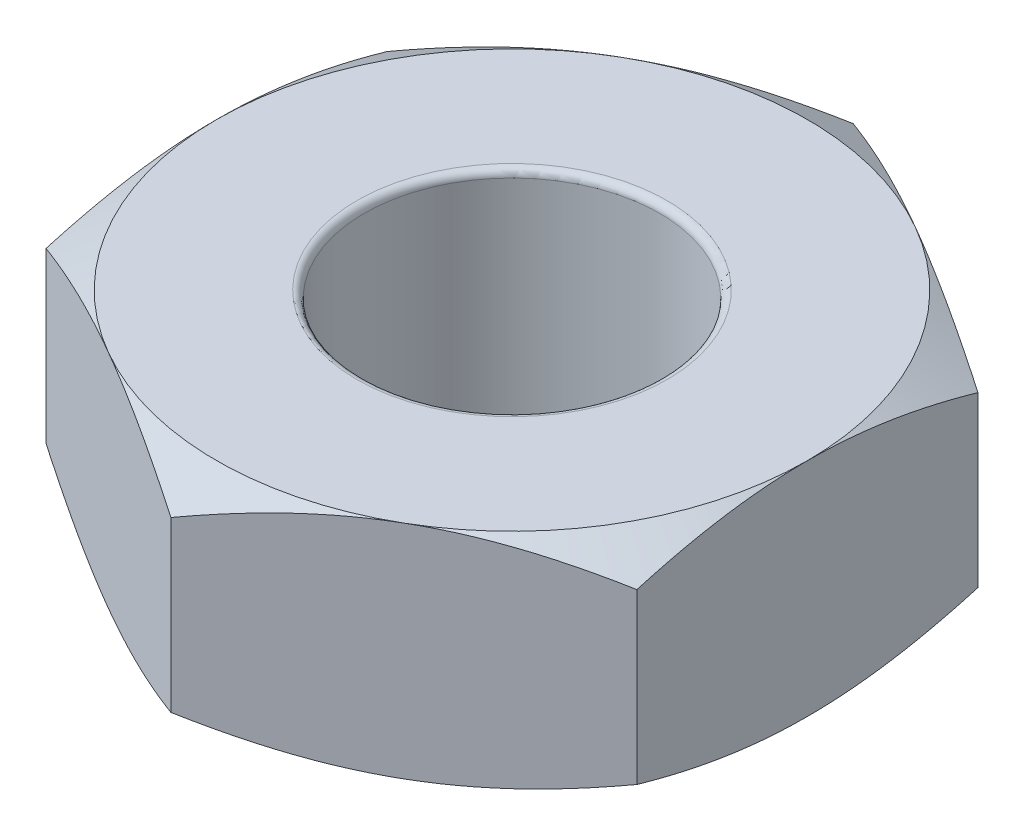
ISO-10303-21;
HEADER;
FILE_DESCRIPTION(('STEP AP214'),'2;1');
FILE_NAME('part.step','',(''),(''),'','','');
FILE_SCHEMA(('AUTOMOTIVE_DESIGN { 1 0 10303 214 1 1 1 1 }'));
ENDSEC;
DATA;
#1=APPLICATION_CONTEXT('core data for automotive mechanical design processes');
#2=APPLICATION_PROTOCOL_DEFINITION('international standard','automotive_design',2000,#1);
#3=PRODUCT_CONTEXT('',#1,'mechanical');
#4=PRODUCT('Part','Part','',(#3));
#5=PRODUCT_RELATED_PRODUCT_CATEGORY('part','',(#4));
#6=PRODUCT_DEFINITION_FORMATION('','',#4);
#7=PRODUCT_DEFINITION_CONTEXT('part definition',#1,'design');
#8=PRODUCT_DEFINITION('design','',#6,#7);
#9=PRODUCT_DEFINITION_SHAPE('','',#8);
#10=(LENGTH_UNIT() NAMED_UNIT(*) SI_UNIT(.MILLI.,.METRE.));
#11=(NAMED_UNIT(*) PLANE_ANGLE_UNIT() SI_UNIT($,.RADIAN.));
#12=(NAMED_UNIT(*) SI_UNIT($,.STERADIAN.) SOLID_ANGLE_UNIT());
#13=UNCERTAINTY_MEASURE_WITH_UNIT(LENGTH_MEASURE(1.E-05),#10,'distance_accuracy_value','');
#14=(GEOMETRIC_REPRESENTATION_CONTEXT(3) GLOBAL_UNCERTAINTY_ASSIGNED_CONTEXT((#13)) GLOBAL_UNIT_ASSIGNED_CONTEXT((#10,
#11,#12)) REPRESENTATION_CONTEXT('',''));
#15=CARTESIAN_POINT('',(0.,0.,0.));
#16=DIRECTION('',(0.,0.,1.));
#17=DIRECTION('',(1.,0.,0.));
#18=AXIS2_PLACEMENT_3D('',#15,#16,#17);
#19=CARTESIAN_POINT('',(2.,1.5,-1.15470053837925));
#20=DIRECTION('',(-0.5,0.,0.866025403784439));
#21=DIRECTION('',(0.866025403784439,0.,0.5));
#22=AXIS2_PLACEMENT_3D('',#19,#20,#21);
#23=PLANE('',#22);
#24=CARTESIAN_POINT('',(-0.000200000000000429,0.178699466620498,-2.30951654681234));
#25=CARTESIAN_POINT('',(0.0876912629000598,0.149389536100679,-2.25877250251758));
#26=CARTESIAN_POINT('',(0.176341194473591,0.122732851980467,-2.20759044065996));
#27=CARTESIAN_POINT('',(0.355176246997801,0.0762024910207211,-2.10433997494456));
#28=CARTESIAN_POINT('',(0.445364546505036,0.0563452763827793,-2.0522697359463));
#29=CARTESIAN_POINT('',(0.624623385763305,0.0254334640232527,-1.94877459684592));
#30=CARTESIAN_POINT('',(0.713666338226303,0.0141731515985312,-1.89736562427197));
#31=CARTESIAN_POINT('',(0.892171397785043,0.00072866259464202,-1.79430568008402));
#32=CARTESIAN_POINT('',(0.981632855703958,-0.00146664504653143,-1.74265508327244));
#33=CARTESIAN_POINT('',(1.1488083535488,0.00309098933064916,-1.64613626458981));
#34=CARTESIAN_POINT('',(1.22654737026578,0.00872487468701473,-1.60125362236173));
#35=CARTESIAN_POINT('',(1.38151891453613,0.0265838952608283,-1.51178075956051));
#36=CARTESIAN_POINT('',(1.4587509057412,0.0388151360234394,-1.46719084864821));
#37=CARTESIAN_POINT('',(1.6140421864822,0.0693934368676098,-1.37753338590959));
#38=CARTESIAN_POINT('',(1.69208181310738,0.0878701670657157,-1.33247718647009));
#39=CARTESIAN_POINT('',(1.84699686569213,0.129805518212855,-1.24303693915876));
#40=CARTESIAN_POINT('',(1.92387427762312,0.153254280492313,-1.1986517446858));
#41=CARTESIAN_POINT('',(2.0002,0.178699466620497,-1.15458506832541));
#42=B_SPLINE_CURVE_WITH_KNOTS('',3,(#24,#25,#26,#27,#28,#29,#30,#31,#32,#33,#34,#35,#36,#37,#38,
#39,#40,#41),.UNSPECIFIED.,.F.,.F.,(4,2,2,2,2,2,2,2,4),(0.,0.31703182469561,0.634825876346563,
0.944753967652636,1.25430138000371,1.52387047293094,1.79368946861028,2.06949491027634,
2.34475850821472),.UNSPECIFIED.);
#43=CARTESIAN_POINT('',(0.,0.178632794954081,-2.3094010767585));
#44=VERTEX_POINT('',#43);
#45=CARTESIAN_POINT('',(1.,0.,-1.73205080756888));
#46=VERTEX_POINT('',#45);
#47=EDGE_CURVE('E63',#44,#46,#42,.T.);
#48=ORIENTED_EDGE('',*,*,#47,.F.);
#49=DIRECTION('',(0.,-1.,0.));
#50=VECTOR('',#49,1.);
#51=CARTESIAN_POINT('',(0.,1.5,-2.3094010767585));
#52=LINE('',#51,#50);
#53=CARTESIAN_POINT('',(0.,1.32136720504592,-2.3094010767585));
#54=VERTEX_POINT('',#53);
#55=EDGE_CURVE('E346',#54,#44,#52,.T.);
#56=ORIENTED_EDGE('',*,*,#55,.F.);
#57=CARTESIAN_POINT('',(2.0002,1.3213005333795,-1.15458506832541));
#58=CARTESIAN_POINT('',(1.91230873709994,1.35061046389932,-1.20532911262018));
#59=CARTESIAN_POINT('',(1.82365880552641,1.37726714801953,-1.2565111744778));
#60=CARTESIAN_POINT('',(1.6448237530022,1.42379750897928,-1.35976164019319));
#61=CARTESIAN_POINT('',(1.55463545349496,1.44365472361722,-1.41183187919145));
#62=CARTESIAN_POINT('',(1.37537661423669,1.47456653597675,-1.51532701829183));
#63=CARTESIAN_POINT('',(1.2863336617737,1.48582684840147,-1.56673599086578));
#64=CARTESIAN_POINT('',(1.10782860221496,1.49927133740536,-1.66979593505373));
#65=CARTESIAN_POINT('',(1.01836714429604,1.50146664504653,-1.72144653186531));
#66=CARTESIAN_POINT('',(0.851191646451201,1.49690901066935,-1.81796535054794));
#67=CARTESIAN_POINT('',(0.773452629734216,1.49127512531299,-1.86284799277603));
#68=CARTESIAN_POINT('',(0.618481085463866,1.47341610473917,-1.95232085557725));
#69=CARTESIAN_POINT('',(0.541249094258801,1.46118486397656,-1.99691076648954));
#70=CARTESIAN_POINT('',(0.385957813517798,1.43060656313239,-2.08656822922816));
#71=CARTESIAN_POINT('',(0.30791818689262,1.41212983293428,-2.13162442866767));
#72=CARTESIAN_POINT('',(0.153003134307864,1.37019448178714,-2.221064675979));
#73=CARTESIAN_POINT('',(0.0761257223768792,1.34674571950769,-2.26544987045196));
#74=CARTESIAN_POINT('',(-0.000200000000000509,1.3213005333795,-2.30951654681234));
#75=B_SPLINE_CURVE_WITH_KNOTS('',3,(#57,#58,#59,#60,#61,#62,#63,#64,#65,#66,#67,#68,#69,#70,#71,
#72,#73,#74),.UNSPECIFIED.,.F.,.F.,(4,2,2,2,2,2,2,2,4),(0.,0.31703182469561,0.634825876346563,
0.944753967652635,1.25430138000371,1.52387047293094,1.79368946861028,2.06949491027634,
2.34475850821472),.UNSPECIFIED.);
#76=CARTESIAN_POINT('',(1.,1.5,-1.73205080756888));
#77=VERTEX_POINT('',#76);
#78=EDGE_CURVE('E278',#77,#54,#75,.T.);
#79=ORIENTED_EDGE('',*,*,#78,.F.);
#80=CARTESIAN_POINT('',(2.,1.32136720504593,-1.15470053837926));
#81=VERTEX_POINT('',#80);
#82=EDGE_CURVE('E365',#81,#77,#75,.T.);
#83=ORIENTED_EDGE('',*,*,#82,.F.);
#84=DIRECTION('',(0.,-1.,0.));
#85=VECTOR('',#84,1.);
#86=CARTESIAN_POINT('',(2.,1.5,-1.15470053837925));
#87=LINE('',#86,#85);
#88=CARTESIAN_POINT('',(2.,0.178632794954081,-1.15470053837925));
#89=VERTEX_POINT('',#88);
#90=EDGE_CURVE('E362',#81,#89,#87,.T.);
#91=ORIENTED_EDGE('',*,*,#90,.T.);
#92=EDGE_CURVE('E151',#46,#89,#42,.T.);
#93=ORIENTED_EDGE('',*,*,#92,.F.);
#94=EDGE_LOOP('',(#48,#56,#79,#83,#91,#93));
#95=FACE_BOUND('',#94,.T.);
#96=ADVANCED_FACE('F47',(#95),#23,.F.);
#97=CARTESIAN_POINT('',(0.,1.5,-2.3094010767585));
#98=DIRECTION('',(0.5,0.,0.866025403784439));
#99=DIRECTION('',(0.866025403784439,0.,-0.5));
#100=AXIS2_PLACEMENT_3D('',#97,#98,#99);
#101=PLANE('',#100);
#102=CARTESIAN_POINT('',(-2.0002,0.178699466620497,-1.15458506832541));
#103=CARTESIAN_POINT('',(-1.91230873709994,0.149389536100679,-1.20532911262018));
#104=CARTESIAN_POINT('',(-1.82365880552641,0.122732851980467,-1.2565111744778));
#105=CARTESIAN_POINT('',(-1.6448237530022,0.076202491020721,-1.35976164019319));
#106=CARTESIAN_POINT('',(-1.55463545349496,0.0563452763827791,-1.41183187919145));
#107=CARTESIAN_POINT('',(-1.37537661423669,0.0254334640232526,-1.51532701829183));
#108=CARTESIAN_POINT('',(-1.2863336617737,0.0141731515985314,-1.56673599086578));
#109=CARTESIAN_POINT('',(-1.10782860221496,0.000728662594642166,-1.66979593505373));
#110=CARTESIAN_POINT('',(-1.01836714429604,-0.00146664504653168,-1.72144653186531));
#111=CARTESIAN_POINT('',(-0.851191646451202,0.00309098933064891,-1.81796535054794));
#112=CARTESIAN_POINT('',(-0.773452629734217,0.00872487468701483,-1.86284799277603));
#113=CARTESIAN_POINT('',(-0.618481085463867,0.0265838952608286,-1.95232085557725));
#114=CARTESIAN_POINT('',(-0.541249094258802,0.0388151360234394,-1.99691076648954));
#115=CARTESIAN_POINT('',(-0.3859578135178,0.0693934368676097,-2.08656822922816));
#116=CARTESIAN_POINT('',(-0.307918186892621,0.0878701670657158,-2.13162442866767));
#117=CARTESIAN_POINT('',(-0.153003134307866,0.129805518212856,-2.221064675979));
#118=CARTESIAN_POINT('',(-0.0761257223768803,0.153254280492313,-2.26544987045196));
#119=CARTESIAN_POINT('',(0.000199999999999503,0.178699466620498,-2.30951654681234));
#120=B_SPLINE_CURVE_WITH_KNOTS('',3,(#102,#103,#104,#105,#106,#107,#108,#109,#110,#111,#112,
#113,#114,#115,#116,#117,#118,#119),.UNSPECIFIED.,.F.,.F.,(4,2,2,2,2,2,2,2,4),(0.,
0.31703182469561,0.634825876346563,0.944753967652636,1.25430138000371,1.52387047293094,
1.79368946861028,2.06949491027634,2.34475850821472),.UNSPECIFIED.);
#121=CARTESIAN_POINT('',(-2.,0.178632794954081,-1.15470053837925));
#122=VERTEX_POINT('',#121);
#123=CARTESIAN_POINT('',(-1.,0.,-1.73205080756888));
#124=VERTEX_POINT('',#123);
#125=EDGE_CURVE('E71',#122,#124,#120,.T.);
#126=ORIENTED_EDGE('',*,*,#125,.F.);
#127=DIRECTION('',(0.,-1.,0.));
#128=VECTOR('',#127,1.);
#129=CARTESIAN_POINT('',(-2.,1.5,-1.15470053837925));
#130=LINE('',#129,#128);
#131=CARTESIAN_POINT('',(-2.,1.32136720504592,-1.15470053837925));
#132=VERTEX_POINT('',#131);
#133=EDGE_CURVE('E350',#132,#122,#130,.T.);
#134=ORIENTED_EDGE('',*,*,#133,.F.);
#135=CARTESIAN_POINT('',(0.000199999999999645,1.3213005333795,-2.30951654681234));
#136=CARTESIAN_POINT('',(-0.0876912629000605,1.35061046389932,-2.25877250251758));
#137=CARTESIAN_POINT('',(-0.176341194473592,1.37726714801953,-2.20759044065996));
#138=CARTESIAN_POINT('',(-0.355176246997802,1.42379750897928,-2.10433997494456));
#139=CARTESIAN_POINT('',(-0.445364546505036,1.44365472361722,-2.0522697359463));
#140=CARTESIAN_POINT('',(-0.624623385763306,1.47456653597675,-1.94877459684592));
#141=CARTESIAN_POINT('',(-0.713666338226304,1.48582684840147,-1.89736562427197));
#142=CARTESIAN_POINT('',(-0.892171397785043,1.49927133740536,-1.79430568008402));
#143=CARTESIAN_POINT('',(-0.981632855703958,1.50146664504653,-1.74265508327244));
#144=CARTESIAN_POINT('',(-1.1488083535488,1.49690901066935,-1.64613626458981));
#145=CARTESIAN_POINT('',(-1.22654737026578,1.49127512531299,-1.60125362236173));
#146=CARTESIAN_POINT('',(-1.38151891453613,1.47341610473917,-1.51178075956051));
#147=CARTESIAN_POINT('',(-1.4587509057412,1.46118486397656,-1.46719084864821));
#148=CARTESIAN_POINT('',(-1.6140421864822,1.43060656313239,-1.37753338590959));
#149=CARTESIAN_POINT('',(-1.69208181310738,1.41212983293428,-1.33247718647009));
#150=CARTESIAN_POINT('',(-1.84699686569213,1.37019448178714,-1.24303693915875));
#151=CARTESIAN_POINT('',(-1.92387427762312,1.34674571950769,-1.1986517446858));
#152=CARTESIAN_POINT('',(-2.0002,1.3213005333795,-1.15458506832541));
#153=B_SPLINE_CURVE_WITH_KNOTS('',3,(#135,#136,#137,#138,#139,#140,#141,#142,#143,#144,#145,
#146,#147,#148,#149,#150,#151,#152),.UNSPECIFIED.,.F.,.F.,(4,2,2,2,2,2,2,2,4),(0.,
0.31703182469561,0.634825876346563,0.944753967652636,1.25430138000371,1.52387047293094,
1.79368946861028,2.06949491027634,2.34475850821472),.UNSPECIFIED.);
#154=CARTESIAN_POINT('',(-1.,1.5,-1.73205080756888));
#155=VERTEX_POINT('',#154);
#156=EDGE_CURVE('E270',#155,#132,#153,.T.);
#157=ORIENTED_EDGE('',*,*,#156,.F.);
#158=EDGE_CURVE('E277',#54,#155,#153,.T.);
#159=ORIENTED_EDGE('',*,*,#158,.F.);
#160=ORIENTED_EDGE('',*,*,#55,.T.);
#161=EDGE_CURVE('E183',#124,#44,#120,.T.);
#162=ORIENTED_EDGE('',*,*,#161,.F.);
#163=EDGE_LOOP('',(#126,#134,#157,#159,#160,#162));
#164=FACE_BOUND('',#163,.T.);
#165=ADVANCED_FACE('F284',(#164),#101,.F.);
#166=CARTESIAN_POINT('',(-2.,1.5,-1.15470053837925));
#167=DIRECTION('',(1.,0.,0.));
#168=DIRECTION('',(0.,0.,-1.));
#169=AXIS2_PLACEMENT_3D('',#166,#167,#168);
#170=PLANE('',#169);
#171=CARTESIAN_POINT('',(-2.,1.38024356206322,3.9086858120223));
#172=CARTESIAN_POINT('',(-2.,1.33338477520942,3.81751112169324));
#173=CARTESIAN_POINT('',(-2.,1.28679021631781,3.72620145046507));
#174=CARTESIAN_POINT('',(-2.,1.19424910626193,3.54325228824929));
#175=CARTESIAN_POINT('',(-2.,1.14830256761152,3.45161279093522));
#176=CARTESIAN_POINT('',(-2.,1.01146715761723,3.17581300243889));
#177=CARTESIAN_POINT('',(-2.,0.921737415753043,2.9910709203634));
#178=CARTESIAN_POINT('',(-2.,0.788409395654004,2.70743624323685));
#179=CARTESIAN_POINT('',(-2.,0.743100656319977,2.60934831774002));
#180=CARTESIAN_POINT('',(-2.,0.654163775473776,2.41241507533712));
#181=CARTESIAN_POINT('',(-2.,0.610535569794256,2.31356978752232));
#182=CARTESIAN_POINT('',(-2.,0.525465312630819,2.11501734395706));
#183=CARTESIAN_POINT('',(-2.,0.48402179743351,2.0153108187193));
#184=CARTESIAN_POINT('',(-2.,0.403937006613857,1.81474539793162));
#185=CARTESIAN_POINT('',(-2.,0.365296392668008,1.71388623674348));
#186=CARTESIAN_POINT('',(-2.,0.285617620657405,1.49400593807688));
#187=CARTESIAN_POINT('',(-2.,0.245241020544741,1.37474151517002));
#188=CARTESIAN_POINT('',(-2.,0.171425178991217,1.13410850020832));
#189=CARTESIAN_POINT('',(-2.,0.137982386760638,1.0127410198025));
#190=CARTESIAN_POINT('',(-2.,0.081016313517748,0.770071934944816));
#191=CARTESIAN_POINT('',(-2.,0.0573164449831597,0.648812992268315));
#192=CARTESIAN_POINT('',(-2.,0.0214266196550794,0.404608758962328));
#193=CARTESIAN_POINT('',(-2.,0.00922997508793474,0.281664490388411));
#194=CARTESIAN_POINT('',(-2.,-0.00207085477321434,0.0335419748269815));
#195=CARTESIAN_POINT('',(-2.,-0.00100267071105179,-0.091644528670964));
#196=CARTESIAN_POINT('',(-2.,0.0144840452379087,-0.341193409529));
#197=CARTESIAN_POINT('',(-2.,0.028907354371388,-0.465555475947226));
#198=CARTESIAN_POINT('',(-2.,0.0695474304125026,-0.714833183390076));
#199=CARTESIAN_POINT('',(-2.,0.095995583954099,-0.83970964218488));
#200=CARTESIAN_POINT('',(-2.,0.157986894429597,-1.08715459095749));
#201=CARTESIAN_POINT('',(-2.,0.193532661864587,-1.20972240762972));
#202=CARTESIAN_POINT('',(-2.,0.269280519283634,-1.44650470413582));
#203=CARTESIAN_POINT('',(-2.,0.309153182000627,-1.56082665519536));
#204=CARTESIAN_POINT('',(-2.,0.393292544621002,-1.78785420479763));
#205=CARTESIAN_POINT('',(-2.,0.437560254612616,-1.90055942493322));
#206=CARTESIAN_POINT('',(-2.,0.529372373860237,-2.12474648121528));
#207=CARTESIAN_POINT('',(-2.,0.576919977737399,-2.23622699843601));
#208=CARTESIAN_POINT('',(-2.,0.674434984945331,-2.45812606854002));
#209=CARTESIAN_POINT('',(-2.,0.724402516378928,-2.56854456483182));
#210=CARTESIAN_POINT('',(-2.,0.823331957292793,-2.78238975570627));
#211=CARTESIAN_POINT('',(-2.,0.87219431445944,-2.88586269009034));
#212=CARTESIAN_POINT('',(-2.,0.971202074310625,-3.09219555395058));
#213=CARTESIAN_POINT('',(-2.,1.02134751719606,-3.19505546409504));
#214=CARTESIAN_POINT('',(-2.,1.12249261908677,-3.39994809054478));
#215=CARTESIAN_POINT('',(-2.,1.1734890679984,-3.50198239517474));
#216=CARTESIAN_POINT('',(-2.,1.27629914354311,-3.70562803087648));
#217=CARTESIAN_POINT('',(-2.,1.32811270118693,-3.80723939675145));
#218=CARTESIAN_POINT('',(-2.,1.38024356206322,-3.9086858120223));
#219=B_SPLINE_CURVE_WITH_KNOTS('',3,(#171,#172,#173,#174,#175,#176,#177,#178,#179,#180,#181,
#182,#183,#184,#185,#186,#187,#188,#189,#190,#191,#192,#193,#194,#195,#196,#197,#198,#199,#200,
#201,#202,#203,#204,#205,#206,#207,#208,#209,#210,#211,#212,#213,#214,#215,#216,#217,#218),
.UNSPECIFIED.,.F.,.F.,(4,2,2,2,2,2,2,2,2,2,2,2,2,2,2,2,2,2,2,2,2,2,2,4),(0.,0.307531563856155,
0.615069058317578,1.23115557383005,1.55528461857819,1.8794012749051,2.20329794302309,
2.52727082574405,2.9048604545366,3.28225624019068,3.65247322929853,4.02247484779028,
4.39728941630346,4.77223811112902,5.15472880172826,5.53732936883045,5.90044039858863,
6.26363507408059,6.62718863760779,6.99076146751935,7.33404016464889,7.67732963038956,
8.01953135999517,8.36170435024385),.UNSPECIFIED.);
#220=CARTESIAN_POINT('',(-2.,0.17863279495408,1.15470053837925));
#221=VERTEX_POINT('',#220);
#222=CARTESIAN_POINT('',(-2.,0.,0.));
#223=VERTEX_POINT('',#222);
#224=EDGE_CURVE('E404',#221,#223,#219,.T.);
#225=ORIENTED_EDGE('',*,*,#224,.F.);
#226=DIRECTION('',(0.,-1.,0.));
#227=VECTOR('',#226,1.);
#228=CARTESIAN_POINT('',(-2.,1.5,1.15470053837925));
#229=LINE('',#228,#227);
#230=CARTESIAN_POINT('',(-2.,1.32136720504592,1.15470053837925));
#231=VERTEX_POINT('',#230);
#232=EDGE_CURVE('E354',#231,#221,#229,.T.);
#233=ORIENTED_EDGE('',*,*,#232,.F.);
#234=CARTESIAN_POINT('',(-2.,0.119756437936776,-3.9086858120223));
#235=CARTESIAN_POINT('',(-2.,0.166615224790584,-3.81751112169324));
#236=CARTESIAN_POINT('',(-2.,0.213209783682194,-3.72620145046507));
#237=CARTESIAN_POINT('',(-2.,0.305750893738074,-3.54325228824929));
#238=CARTESIAN_POINT('',(-2.,0.351697432388484,-3.45161279093522));
#239=CARTESIAN_POINT('',(-2.,0.488532842382774,-3.17581300243889));
#240=CARTESIAN_POINT('',(-2.,0.578262584246957,-2.9910709203634));
#241=CARTESIAN_POINT('',(-2.,0.711590604345996,-2.70743624323685));
#242=CARTESIAN_POINT('',(-2.,0.756899343680022,-2.60934831774002));
#243=CARTESIAN_POINT('',(-2.,0.845836224526224,-2.41241507533712));
#244=CARTESIAN_POINT('',(-2.,0.889464430205744,-2.31356978752231));
#245=CARTESIAN_POINT('',(-2.,0.974534687369181,-2.11501734395706));
#246=CARTESIAN_POINT('',(-2.,1.01597820256649,-2.0153108187193));
#247=CARTESIAN_POINT('',(-2.,1.09606299338614,-1.81474539793162));
#248=CARTESIAN_POINT('',(-2.,1.13470360733199,-1.71388623674348));
#249=CARTESIAN_POINT('',(-2.,1.21438237934259,-1.49400593807688));
#250=CARTESIAN_POINT('',(-2.,1.25475897945526,-1.37474151517002));
#251=CARTESIAN_POINT('',(-2.,1.32857482100878,-1.13410850020832));
#252=CARTESIAN_POINT('',(-2.,1.36201761323936,-1.0127410198025));
#253=CARTESIAN_POINT('',(-2.,1.41898368648225,-0.770071934944817));
#254=CARTESIAN_POINT('',(-2.,1.44268355501684,-0.648812992268316));
#255=CARTESIAN_POINT('',(-2.,1.47857338034492,-0.404608758962328));
#256=CARTESIAN_POINT('',(-2.,1.49077002491207,-0.281664490388411));
#257=CARTESIAN_POINT('',(-2.,1.50207085477321,-0.0335419748269814));
#258=CARTESIAN_POINT('',(-2.,1.50100267071105,0.0916445286709641));
#259=CARTESIAN_POINT('',(-2.,1.48551595476209,0.341193409529));
#260=CARTESIAN_POINT('',(-2.,1.47109264562861,0.465555475947226));
#261=CARTESIAN_POINT('',(-2.,1.4304525695875,0.714833183390077));
#262=CARTESIAN_POINT('',(-2.,1.4040044160459,0.839709642184881));
#263=CARTESIAN_POINT('',(-2.,1.3420131055704,1.08715459095749));
#264=CARTESIAN_POINT('',(-2.,1.30646733813541,1.20972240762972));
#265=CARTESIAN_POINT('',(-2.,1.23071948071637,1.44650470413582));
#266=CARTESIAN_POINT('',(-2.,1.19084681799937,1.56082665519536));
#267=CARTESIAN_POINT('',(-2.,1.106707455379,1.78785420479763));
#268=CARTESIAN_POINT('',(-2.,1.06243974538738,1.90055942493322));
#269=CARTESIAN_POINT('',(-2.,0.970627626139764,2.12474648121528));
#270=CARTESIAN_POINT('',(-2.,0.923080022262602,2.23622699843601));
#271=CARTESIAN_POINT('',(-2.,0.82556501505467,2.45812606854002));
#272=CARTESIAN_POINT('',(-2.,0.775597483621073,2.56854456483182));
#273=CARTESIAN_POINT('',(-2.,0.676668042707208,2.78238975570627));
#274=CARTESIAN_POINT('',(-2.,0.627805685540561,2.88586269009034));
#275=CARTESIAN_POINT('',(-2.,0.528797925689376,3.09219555395058));
#276=CARTESIAN_POINT('',(-2.,0.478652482803939,3.19505546409504));
#277=CARTESIAN_POINT('',(-2.,0.377507380913227,3.39994809054478));
#278=CARTESIAN_POINT('',(-2.,0.326510932001602,3.50198239517474));
#279=CARTESIAN_POINT('',(-2.,0.223700856456886,3.70562803087648));
#280=CARTESIAN_POINT('',(-2.,0.17188729881307,3.80723939675145));
#281=CARTESIAN_POINT('',(-2.,0.119756437936776,3.9086858120223));
#282=B_SPLINE_CURVE_WITH_KNOTS('',3,(#234,#235,#236,#237,#238,#239,#240,#241,#242,#243,#244,
#245,#246,#247,#248,#249,#250,#251,#252,#253,#254,#255,#256,#257,#258,#259,#260,#261,#262,#263,
#264,#265,#266,#267,#268,#269,#270,#271,#272,#273,#274,#275,#276,#277,#278,#279,#280,#281),
.UNSPECIFIED.,.F.,.F.,(4,2,2,2,2,2,2,2,2,2,2,2,2,2,2,2,2,2,2,2,2,2,2,4),(0.,0.307531563856155,
0.615069058317577,1.23115557383005,1.55528461857819,1.8794012749051,2.20329794302309,
2.52727082574405,2.9048604545366,3.28225624019068,3.65247322929853,4.02247484779028,
4.39728941630346,4.77223811112902,5.15472880172826,5.53732936883045,5.90044039858863,
6.26363507408059,6.62718863760779,6.99076146751935,7.33404016464889,7.67732963038956,
8.01953135999518,8.36170435024385),.UNSPECIFIED.);
#283=CARTESIAN_POINT('',(-2.,1.5,0.));
#284=VERTEX_POINT('',#283);
#285=EDGE_CURVE('E262',#284,#231,#282,.T.);
#286=ORIENTED_EDGE('',*,*,#285,.F.);
#287=EDGE_CURVE('E269',#132,#284,#282,.T.);
#288=ORIENTED_EDGE('',*,*,#287,.F.);
#289=ORIENTED_EDGE('',*,*,#133,.T.);
#290=EDGE_CURVE('E219',#223,#122,#219,.T.);
#291=ORIENTED_EDGE('',*,*,#290,.F.);
#292=EDGE_LOOP('',(#225,#233,#286,#288,#289,#291));
#293=FACE_BOUND('',#292,.T.);
#294=ADVANCED_FACE('F242',(#293),#170,.F.);
#295=CARTESIAN_POINT('',(-2.,1.5,1.15470053837925));
#296=DIRECTION('',(0.5,0.,-0.866025403784439));
#297=DIRECTION('',(-0.866025403784439,0.,-0.5));
#298=AXIS2_PLACEMENT_3D('',#295,#296,#297);
#299=PLANE('',#298);
#300=CARTESIAN_POINT('',(0.000200000000000457,0.178699466620497,2.30951654681234));
#301=CARTESIAN_POINT('',(-0.0876912629000594,0.149389536100678,2.25877250251758));
#302=CARTESIAN_POINT('',(-0.176341194473591,0.122732851980466,2.20759044065995));
#303=CARTESIAN_POINT('',(-0.355176246997802,0.0762024910207209,2.10433997494456));
#304=CARTESIAN_POINT('',(-0.445364546505036,0.0563452763827791,2.0522697359463));
#305=CARTESIAN_POINT('',(-0.624623385763305,0.0254334640232526,1.94877459684592));
#306=CARTESIAN_POINT('',(-0.713666338226303,0.0141731515985312,1.89736562427197));
#307=CARTESIAN_POINT('',(-0.892171397785042,0.000728662594641913,1.79430568008402));
#308=CARTESIAN_POINT('',(-0.981632855703957,-0.00146664504653171,1.74265508327244));
#309=CARTESIAN_POINT('',(-1.1488083535488,0.00309098933064888,1.64613626458981));
#310=CARTESIAN_POINT('',(-1.22654737026578,0.00872487468701461,1.60125362236173));
#311=CARTESIAN_POINT('',(-1.38151891453613,0.0265838952608284,1.51178075956051));
#312=CARTESIAN_POINT('',(-1.4587509057412,0.0388151360234394,1.46719084864821));
#313=CARTESIAN_POINT('',(-1.6140421864822,0.0693934368676097,1.37753338590959));
#314=CARTESIAN_POINT('',(-1.69208181310738,0.0878701670657157,1.33247718647009));
#315=CARTESIAN_POINT('',(-1.84699686569213,0.129805518212855,1.24303693915875));
#316=CARTESIAN_POINT('',(-1.92387427762312,0.153254280492313,1.1986517446858));
#317=CARTESIAN_POINT('',(-2.0002,0.178699466620497,1.15458506832541));
#318=B_SPLINE_CURVE_WITH_KNOTS('',3,(#300,#301,#302,#303,#304,#305,#306,#307,#308,#309,#310,
#311,#312,#313,#314,#315,#316,#317),.UNSPECIFIED.,.F.,.F.,(4,2,2,2,2,2,2,2,4),(0.,
0.31703182469561,0.634825876346563,0.944753967652635,1.25430138000371,1.52387047293094,
1.79368946861028,2.06949491027634,2.34475850821472),.UNSPECIFIED.);
#319=CARTESIAN_POINT('',(0.,0.178632794954081,2.3094010767585));
#320=VERTEX_POINT('',#319);
#321=CARTESIAN_POINT('',(-1.,0.,1.73205080756888));
#322=VERTEX_POINT('',#321);
#323=EDGE_CURVE('E161',#320,#322,#318,.T.);
#324=ORIENTED_EDGE('',*,*,#323,.F.);
#325=DIRECTION('',(0.,-1.,0.));
#326=VECTOR('',#325,1.);
#327=CARTESIAN_POINT('',(0.,1.5,2.3094010767585));
#328=LINE('',#327,#326);
#329=CARTESIAN_POINT('',(0.,1.32136720504592,2.3094010767585));
#330=VERTEX_POINT('',#329);
#331=EDGE_CURVE('E179',#330,#320,#328,.T.);
#332=ORIENTED_EDGE('',*,*,#331,.F.);
#333=CARTESIAN_POINT('',(-2.0002,1.3213005333795,1.15458506832541));
#334=CARTESIAN_POINT('',(-1.91230873709994,1.35061046389932,1.20532911262018));
#335=CARTESIAN_POINT('',(-1.82365880552641,1.37726714801953,1.2565111744778));
#336=CARTESIAN_POINT('',(-1.6448237530022,1.42379750897928,1.35976164019319));
#337=CARTESIAN_POINT('',(-1.55463545349496,1.44365472361722,1.41183187919145));
#338=CARTESIAN_POINT('',(-1.37537661423669,1.47456653597675,1.51532701829183));
#339=CARTESIAN_POINT('',(-1.2863336617737,1.48582684840147,1.56673599086578));
#340=CARTESIAN_POINT('',(-1.10782860221496,1.49927133740536,1.66979593505373));
#341=CARTESIAN_POINT('',(-1.01836714429604,1.50146664504653,1.72144653186531));
#342=CARTESIAN_POINT('',(-0.851191646451201,1.49690901066935,1.81796535054794));
#343=CARTESIAN_POINT('',(-0.773452629734216,1.49127512531299,1.86284799277603));
#344=CARTESIAN_POINT('',(-0.618481085463866,1.47341610473917,1.95232085557725));
#345=CARTESIAN_POINT('',(-0.541249094258801,1.46118486397656,1.99691076648954));
#346=CARTESIAN_POINT('',(-0.385957813517799,1.43060656313239,2.08656822922816));
#347=CARTESIAN_POINT('',(-0.30791818689262,1.41212983293428,2.13162442866767));
#348=CARTESIAN_POINT('',(-0.153003134307865,1.37019448178714,2.221064675979));
#349=CARTESIAN_POINT('',(-0.0761257223768795,1.34674571950769,2.26544987045196));
#350=CARTESIAN_POINT('',(0.000200000000000636,1.3213005333795,2.30951654681234));
#351=B_SPLINE_CURVE_WITH_KNOTS('',3,(#333,#334,#335,#336,#337,#338,#339,#340,#341,#342,#343,
#344,#345,#346,#347,#348,#349,#350),.UNSPECIFIED.,.F.,.F.,(4,2,2,2,2,2,2,2,4),(0.,
0.31703182469561,0.634825876346563,0.944753967652636,1.25430138000371,1.52387047293094,
1.79368946861028,2.06949491027634,2.34475850821472),.UNSPECIFIED.);
#352=CARTESIAN_POINT('',(-1.,1.5,1.73205080756888));
#353=VERTEX_POINT('',#352);
#354=EDGE_CURVE('E247',#353,#330,#351,.T.);
#355=ORIENTED_EDGE('',*,*,#354,.F.);
#356=EDGE_CURVE('E255',#231,#353,#351,.T.);
#357=ORIENTED_EDGE('',*,*,#356,.F.);
#358=ORIENTED_EDGE('',*,*,#232,.T.);
#359=EDGE_CURVE('E185',#322,#221,#318,.T.);
#360=ORIENTED_EDGE('',*,*,#359,.F.);
#361=EDGE_LOOP('',(#324,#332,#355,#357,#358,#360));
#362=FACE_BOUND('',#361,.T.);
#363=ADVANCED_FACE('F239',(#362),#299,.F.);
#364=CARTESIAN_POINT('',(0.,1.5,2.3094010767585));
#365=DIRECTION('',(-0.5,0.,-0.866025403784439));
#366=DIRECTION('',(-0.866025403784439,0.,0.5));
#367=AXIS2_PLACEMENT_3D('',#364,#365,#366);
#368=PLANE('',#367);
#369=CARTESIAN_POINT('',(2.0002,0.178699466620498,1.15458506832541));
#370=CARTESIAN_POINT('',(1.91230873709994,0.149389536100679,1.20532911262018));
#371=CARTESIAN_POINT('',(1.82365880552641,0.122732851980467,1.2565111744778));
#372=CARTESIAN_POINT('',(1.6448237530022,0.0762024910207211,1.35976164019319));
#373=CARTESIAN_POINT('',(1.55463545349496,0.0563452763827794,1.41183187919145));
#374=CARTESIAN_POINT('',(1.37537661423669,0.0254334640232528,1.51532701829183));
#375=CARTESIAN_POINT('',(1.2863336617737,0.0141731515985312,1.56673599086578));
#376=CARTESIAN_POINT('',(1.10782860221496,0.000728662594641981,1.66979593505373));
#377=CARTESIAN_POINT('',(1.01836714429604,-0.00146664504653151,1.72144653186531));
#378=CARTESIAN_POINT('',(0.851191646451202,0.00309098933064911,1.81796535054794));
#379=CARTESIAN_POINT('',(0.773452629734216,0.00872487468701477,1.86284799277603));
#380=CARTESIAN_POINT('',(0.618481085463867,0.0265838952608284,1.95232085557725));
#381=CARTESIAN_POINT('',(0.541249094258802,0.0388151360234394,1.99691076648954));
#382=CARTESIAN_POINT('',(0.385957813517799,0.0693934368676097,2.08656822922816));
#383=CARTESIAN_POINT('',(0.307918186892621,0.0878701670657157,2.13162442866767));
#384=CARTESIAN_POINT('',(0.153003134307865,0.129805518212856,2.221064675979));
#385=CARTESIAN_POINT('',(0.0761257223768802,0.153254280492313,2.26544987045196));
#386=CARTESIAN_POINT('',(-0.000199999999999813,0.178699466620497,2.30951654681234));
#387=B_SPLINE_CURVE_WITH_KNOTS('',3,(#369,#370,#371,#372,#373,#374,#375,#376,#377,#378,#379,
#380,#381,#382,#383,#384,#385,#386),.UNSPECIFIED.,.F.,.F.,(4,2,2,2,2,2,2,2,4),(0.,
0.31703182469561,0.634825876346563,0.944753967652635,1.25430138000371,1.52387047293094,
1.79368946861028,2.06949491027634,2.34475850821472),.UNSPECIFIED.);
#388=CARTESIAN_POINT('',(2.,0.178632794954074,1.15470053837926));
#389=VERTEX_POINT('',#388);
#390=CARTESIAN_POINT('',(1.,0.,1.73205080756888));
#391=VERTEX_POINT('',#390);
#392=EDGE_CURVE('E138',#389,#391,#387,.T.);
#393=ORIENTED_EDGE('',*,*,#392,.F.);
#394=DIRECTION('',(0.,-1.,0.));
#395=VECTOR('',#394,1.);
#396=CARTESIAN_POINT('',(2.,1.5,1.15470053837925));
#397=LINE('',#396,#395);
#398=CARTESIAN_POINT('',(2.,1.32136720504592,1.15470053837925));
#399=VERTEX_POINT('',#398);
#400=EDGE_CURVE('E360',#399,#389,#397,.T.);
#401=ORIENTED_EDGE('',*,*,#400,.F.);
#402=CARTESIAN_POINT('',(-0.000199999999999574,1.3213005333795,2.30951654681234));
#403=CARTESIAN_POINT('',(0.0876912629000607,1.35061046389932,2.25877250251758));
#404=CARTESIAN_POINT('',(0.176341194473592,1.37726714801953,2.20759044065995));
#405=CARTESIAN_POINT('',(0.355176246997802,1.42379750897928,2.10433997494456));
#406=CARTESIAN_POINT('',(0.445364546505037,1.44365472361722,2.0522697359463));
#407=CARTESIAN_POINT('',(0.624623385763306,1.47456653597675,1.94877459684592));
#408=CARTESIAN_POINT('',(0.713666338226304,1.48582684840147,1.89736562427197));
#409=CARTESIAN_POINT('',(0.892171397785043,1.49927133740536,1.79430568008402));
#410=CARTESIAN_POINT('',(0.981632855703958,1.50146664504653,1.74265508327244));
#411=CARTESIAN_POINT('',(1.1488083535488,1.49690901066935,1.64613626458981));
#412=CARTESIAN_POINT('',(1.22654737026578,1.49127512531299,1.60125362236173));
#413=CARTESIAN_POINT('',(1.38151891453613,1.47341610473917,1.51178075956051));
#414=CARTESIAN_POINT('',(1.4587509057412,1.46118486397656,1.46719084864821));
#415=CARTESIAN_POINT('',(1.6140421864822,1.43060656313239,1.37753338590959));
#416=CARTESIAN_POINT('',(1.69208181310738,1.41212983293428,1.33247718647009));
#417=CARTESIAN_POINT('',(1.84699686569214,1.37019448178714,1.24303693915875));
#418=CARTESIAN_POINT('',(1.92387427762312,1.34674571950769,1.1986517446858));
#419=CARTESIAN_POINT('',(2.0002,1.3213005333795,1.15458506832541));
#420=B_SPLINE_CURVE_WITH_KNOTS('',3,(#402,#403,#404,#405,#406,#407,#408,#409,#410,#411,#412,
#413,#414,#415,#416,#417,#418,#419),.UNSPECIFIED.,.F.,.F.,(4,2,2,2,2,2,2,2,4),(0.,
0.31703182469561,0.634825876346563,0.944753967652635,1.25430138000371,1.52387047293094,
1.79368946861028,2.06949491027634,2.34475850821472),.UNSPECIFIED.);
#421=CARTESIAN_POINT('',(1.,1.5,1.73205080756888));
#422=VERTEX_POINT('',#421);
#423=EDGE_CURVE('E257',#422,#399,#420,.T.);
#424=ORIENTED_EDGE('',*,*,#423,.F.);
#425=EDGE_CURVE('E256',#330,#422,#420,.T.);
#426=ORIENTED_EDGE('',*,*,#425,.F.);
#427=ORIENTED_EDGE('',*,*,#331,.T.);
#428=EDGE_CURVE('E154',#391,#320,#387,.T.);
#429=ORIENTED_EDGE('',*,*,#428,.F.);
#430=EDGE_LOOP('',(#393,#401,#424,#426,#427,#429));
#431=FACE_BOUND('',#430,.T.);
#432=ADVANCED_FACE('F176',(#431),#368,.F.);
#433=CARTESIAN_POINT('',(2.,1.5,1.15470053837925));
#434=DIRECTION('',(-1.,0.,0.));
#435=DIRECTION('',(0.,0.,1.));
#436=AXIS2_PLACEMENT_3D('',#433,#434,#435);
#437=PLANE('',#436);
#438=CARTESIAN_POINT('',(2.,1.38024356206322,-3.9086858120223));
#439=CARTESIAN_POINT('',(2.,1.33338477520942,-3.81751112169324));
#440=CARTESIAN_POINT('',(2.,1.28679021631781,-3.72620145046507));
#441=CARTESIAN_POINT('',(2.,1.19424910626193,-3.54325228824929));
#442=CARTESIAN_POINT('',(2.,1.14830256761152,-3.45161279093522));
#443=CARTESIAN_POINT('',(2.,1.01146715761723,-3.17581300243889));
#444=CARTESIAN_POINT('',(2.,0.921737415753043,-2.9910709203634));
#445=CARTESIAN_POINT('',(2.,0.788409395654004,-2.70743624323685));
#446=CARTESIAN_POINT('',(2.,0.743100656319978,-2.60934831774003));
#447=CARTESIAN_POINT('',(2.,0.654163775473776,-2.41241507533712));
#448=CARTESIAN_POINT('',(2.,0.610535569794256,-2.31356978752232));
#449=CARTESIAN_POINT('',(2.,0.525465312630819,-2.11501734395706));
#450=CARTESIAN_POINT('',(2.,0.484021797433511,-2.0153108187193));
#451=CARTESIAN_POINT('',(2.,0.403937006613858,-1.81474539793162));
#452=CARTESIAN_POINT('',(2.,0.365296392668009,-1.71388623674348));
#453=CARTESIAN_POINT('',(2.,0.285617620657406,-1.49400593807688));
#454=CARTESIAN_POINT('',(2.,0.245241020544741,-1.37474151517002));
#455=CARTESIAN_POINT('',(2.,0.171425178991217,-1.13410850020832));
#456=CARTESIAN_POINT('',(2.,0.137982386760639,-1.0127410198025));
#457=CARTESIAN_POINT('',(2.,0.0810163135177482,-0.770071934944817));
#458=CARTESIAN_POINT('',(2.,0.0573164449831599,-0.648812992268317));
#459=CARTESIAN_POINT('',(2.,0.0214266196550794,-0.404608758962329));
#460=CARTESIAN_POINT('',(2.,0.00922997508793463,-0.281664490388412));
#461=CARTESIAN_POINT('',(2.,-0.00207085477321453,-0.0335419748269826));
#462=CARTESIAN_POINT('',(2.,-0.00100267071105193,0.0916445286709633));
#463=CARTESIAN_POINT('',(2.,0.0144840452379087,0.341193409528999));
#464=CARTESIAN_POINT('',(2.,0.0289073543713878,0.465555475947225));
#465=CARTESIAN_POINT('',(2.,0.0695474304125025,0.714833183390076));
#466=CARTESIAN_POINT('',(2.,0.095995583954099,0.83970964218488));
#467=CARTESIAN_POINT('',(2.,0.157986894429597,1.08715459095749));
#468=CARTESIAN_POINT('',(2.,0.193532661864587,1.20972240762972));
#469=CARTESIAN_POINT('',(2.,0.269280519283633,1.44650470413582));
#470=CARTESIAN_POINT('',(2.,0.309153182000626,1.56082665519536));
#471=CARTESIAN_POINT('',(2.,0.393292544621001,1.78785420479763));
#472=CARTESIAN_POINT('',(2.,0.437560254612615,1.90055942493322));
#473=CARTESIAN_POINT('',(2.,0.529372373860235,2.12474648121528));
#474=CARTESIAN_POINT('',(2.,0.576919977737398,2.23622699843601));
#475=CARTESIAN_POINT('',(2.,0.67443498494533,2.45812606854002));
#476=CARTESIAN_POINT('',(2.,0.724402516378927,2.56854456483181));
#477=CARTESIAN_POINT('',(2.,0.823331957292792,2.78238975570627));
#478=CARTESIAN_POINT('',(2.,0.872194314459439,2.88586269009034));
#479=CARTESIAN_POINT('',(2.,0.971202074310625,3.09219555395058));
#480=CARTESIAN_POINT('',(2.,1.02134751719606,3.19505546409504));
#481=CARTESIAN_POINT('',(2.,1.12249261908677,3.39994809054478));
#482=CARTESIAN_POINT('',(2.,1.1734890679984,3.50198239517474));
#483=CARTESIAN_POINT('',(2.,1.27629914354312,3.70562803087648));
#484=CARTESIAN_POINT('',(2.,1.32811270118693,3.80723939675145));
#485=CARTESIAN_POINT('',(2.,1.38024356206322,3.9086858120223));
#486=B_SPLINE_CURVE_WITH_KNOTS('',3,(#438,#439,#440,#441,#442,#443,#444,#445,#446,#447,#448,
#449,#450,#451,#452,#453,#454,#455,#456,#457,#458,#459,#460,#461,#462,#463,#464,#465,#466,#467,
#468,#469,#470,#471,#472,#473,#474,#475,#476,#477,#478,#479,#480,#481,#482,#483,#484,#485),
.UNSPECIFIED.,.F.,.F.,(4,2,2,2,2,2,2,2,2,2,2,2,2,2,2,2,2,2,2,2,2,2,2,4),(0.,0.307531563856155,
0.615069058317578,1.23115557383005,1.55528461857819,1.8794012749051,2.20329794302309,
2.52727082574405,2.9048604545366,3.28225624019068,3.65247322929853,4.02247484779028,
4.39728941630346,4.77223811112902,5.15472880172826,5.53732936883045,5.90044039858862,
6.26363507408059,6.62718863760779,6.99076146751934,7.33404016464889,7.67732963038956,
8.01953135999518,8.36170435024385),.UNSPECIFIED.);
#487=CARTESIAN_POINT('',(2.,0.,0.));
#488=VERTEX_POINT('',#487);
#489=EDGE_CURVE('E152',#89,#488,#486,.T.);
#490=ORIENTED_EDGE('',*,*,#489,.F.);
#491=ORIENTED_EDGE('',*,*,#90,.F.);
#492=CARTESIAN_POINT('',(2.,0.119756437936775,3.9086858120223));
#493=CARTESIAN_POINT('',(2.,0.166615224790584,3.81751112169324));
#494=CARTESIAN_POINT('',(2.,0.213209783682193,3.72620145046507));
#495=CARTESIAN_POINT('',(2.,0.305750893738074,3.54325228824929));
#496=CARTESIAN_POINT('',(2.,0.351697432388484,3.45161279093522));
#497=CARTESIAN_POINT('',(2.,0.488532842382774,3.17581300243889));
#498=CARTESIAN_POINT('',(2.,0.578262584246956,2.9910709203634));
#499=CARTESIAN_POINT('',(2.,0.711590604345996,2.70743624323685));
#500=CARTESIAN_POINT('',(2.,0.756899343680022,2.60934831774002));
#501=CARTESIAN_POINT('',(2.,0.845836224526223,2.41241507533712));
#502=CARTESIAN_POINT('',(2.,0.889464430205743,2.31356978752231));
#503=CARTESIAN_POINT('',(2.,0.974534687369181,2.11501734395706));
#504=CARTESIAN_POINT('',(2.,1.01597820256649,2.0153108187193));
#505=CARTESIAN_POINT('',(2.,1.09606299338614,1.81474539793162));
#506=CARTESIAN_POINT('',(2.,1.13470360733199,1.71388623674348));
#507=CARTESIAN_POINT('',(2.,1.21438237934259,1.49400593807688));
#508=CARTESIAN_POINT('',(2.,1.25475897945526,1.37474151517002));
#509=CARTESIAN_POINT('',(2.,1.32857482100878,1.13410850020832));
#510=CARTESIAN_POINT('',(2.,1.36201761323936,1.0127410198025));
#511=CARTESIAN_POINT('',(2.,1.41898368648225,0.770071934944816));
#512=CARTESIAN_POINT('',(2.,1.44268355501684,0.648812992268315));
#513=CARTESIAN_POINT('',(2.,1.47857338034492,0.404608758962328));
#514=CARTESIAN_POINT('',(2.,1.49077002491207,0.28166449038841));
#515=CARTESIAN_POINT('',(2.,1.50207085477321,0.0335419748269807));
#516=CARTESIAN_POINT('',(2.,1.50100267071105,-0.0916445286709651));
#517=CARTESIAN_POINT('',(2.,1.48551595476209,-0.341193409529001));
#518=CARTESIAN_POINT('',(2.,1.47109264562861,-0.465555475947227));
#519=CARTESIAN_POINT('',(2.,1.4304525695875,-0.714833183390077));
#520=CARTESIAN_POINT('',(2.,1.4040044160459,-0.839709642184881));
#521=CARTESIAN_POINT('',(2.,1.3420131055704,-1.08715459095749));
#522=CARTESIAN_POINT('',(2.,1.30646733813541,-1.20972240762972));
#523=CARTESIAN_POINT('',(2.,1.23071948071637,-1.44650470413582));
#524=CARTESIAN_POINT('',(2.,1.19084681799937,-1.56082665519536));
#525=CARTESIAN_POINT('',(2.,1.106707455379,-1.78785420479763));
#526=CARTESIAN_POINT('',(2.,1.06243974538738,-1.90055942493322));
#527=CARTESIAN_POINT('',(2.,0.970627626139764,-2.12474648121528));
#528=CARTESIAN_POINT('',(2.,0.923080022262602,-2.23622699843601));
#529=CARTESIAN_POINT('',(2.,0.82556501505467,-2.45812606854002));
#530=CARTESIAN_POINT('',(2.,0.775597483621073,-2.56854456483182));
#531=CARTESIAN_POINT('',(2.,0.676668042707208,-2.78238975570627));
#532=CARTESIAN_POINT('',(2.,0.627805685540561,-2.88586269009034));
#533=CARTESIAN_POINT('',(2.,0.528797925689375,-3.09219555395058));
#534=CARTESIAN_POINT('',(2.,0.478652482803938,-3.19505546409504));
#535=CARTESIAN_POINT('',(2.,0.377507380913227,-3.39994809054478));
#536=CARTESIAN_POINT('',(2.,0.326510932001601,-3.50198239517474));
#537=CARTESIAN_POINT('',(2.,0.223700856456885,-3.70562803087648));
#538=CARTESIAN_POINT('',(2.,0.17188729881307,-3.80723939675145));
#539=CARTESIAN_POINT('',(2.,0.119756437936776,-3.9086858120223));
#540=B_SPLINE_CURVE_WITH_KNOTS('',3,(#492,#493,#494,#495,#496,#497,#498,#499,#500,#501,#502,
#503,#504,#505,#506,#507,#508,#509,#510,#511,#512,#513,#514,#515,#516,#517,#518,#519,#520,#521,
#522,#523,#524,#525,#526,#527,#528,#529,#530,#531,#532,#533,#534,#535,#536,#537,#538,#539),
.UNSPECIFIED.,.F.,.F.,(4,2,2,2,2,2,2,2,2,2,2,2,2,2,2,2,2,2,2,2,2,2,2,4),(0.,0.307531563856155,
0.615069058317578,1.23115557383005,1.55528461857819,1.8794012749051,2.2032979430231,
2.52727082574406,2.9048604545366,3.28225624019068,3.65247322929854,4.02247484779028,
4.39728941630346,4.77223811112903,5.15472880172826,5.53732936883045,5.90044039858863,
6.26363507408059,6.62718863760779,6.99076146751935,7.33404016464889,7.67732963038956,
8.01953135999518,8.36170435024385),.UNSPECIFIED.);
#541=CARTESIAN_POINT('',(2.,1.5,0.));
#542=VERTEX_POINT('',#541);
#543=EDGE_CURVE('E339',#542,#81,#540,.T.);
#544=ORIENTED_EDGE('',*,*,#543,.F.);
#545=EDGE_CURVE('E167',#399,#542,#540,.T.);
#546=ORIENTED_EDGE('',*,*,#545,.F.);
#547=ORIENTED_EDGE('',*,*,#400,.T.);
#548=EDGE_CURVE('E145',#488,#389,#486,.T.);
#549=ORIENTED_EDGE('',*,*,#548,.F.);
#550=EDGE_LOOP('',(#490,#491,#544,#546,#547,#549));
#551=FACE_BOUND('',#550,.T.);
#552=ADVANCED_FACE('F334',(#551),#437,.F.);
#553=CARTESIAN_POINT('',(0.,0.,0.));
#554=DIRECTION('',(0.,1.,0.));
#555=DIRECTION('',(0.,0.,1.));
#556=AXIS2_PLACEMENT_3D('',#553,#554,#555);
#557=PLANE('',#556);
#558=CARTESIAN_POINT('',(0.,0.,0.));
#559=DIRECTION('',(0.,1.,0.));
#560=DIRECTION('',(0.,0.,1.));
#561=AXIS2_PLACEMENT_3D('',#558,#559,#560);
#562=CIRCLE('',#561,1.05);
#563=CARTESIAN_POINT('',(0.,0.,1.05));
#564=VERTEX_POINT('',#563);
#565=EDGE_CURVE('E173',#564,#564,#562,.T.);
#566=ORIENTED_EDGE('',*,*,#565,.T.);
#567=EDGE_LOOP('',(#566));
#568=FACE_BOUND('',#567,.T.);
#569=CARTESIAN_POINT('',(0.,0.,0.));
#570=DIRECTION('',(0.,1.,0.));
#571=DIRECTION('',(0.,0.,1.));
#572=AXIS2_PLACEMENT_3D('',#569,#570,#571);
#573=CIRCLE('',#572,2.);
#574=EDGE_CURVE('E142',#391,#488,#573,.T.);
#575=ORIENTED_EDGE('',*,*,#574,.F.);
#576=EDGE_CURVE('E158',#322,#391,#573,.T.);
#577=ORIENTED_EDGE('',*,*,#576,.F.);
#578=EDGE_CURVE('E166',#223,#322,#573,.T.);
#579=ORIENTED_EDGE('',*,*,#578,.F.);
#580=EDGE_CURVE('E434',#124,#223,#573,.T.);
#581=ORIENTED_EDGE('',*,*,#580,.F.);
#582=EDGE_CURVE('E174',#46,#124,#573,.T.);
#583=ORIENTED_EDGE('',*,*,#582,.F.);
#584=CARTESIAN_POINT('',(0.,0.,0.));
#585=DIRECTION('',(0.,-1.,0.));
#586=DIRECTION('',(0.,0.,-1.));
#587=AXIS2_PLACEMENT_3D('',#584,#585,#586);
#588=CIRCLE('',#587,2.);
#589=EDGE_CURVE('E171',#46,#488,#588,.T.);
#590=ORIENTED_EDGE('',*,*,#589,.T.);
#591=EDGE_LOOP('',(#575,#577,#579,#581,#583,#590));
#592=FACE_BOUND('',#591,.T.);
#593=ADVANCED_FACE('F169',(#568,#592),#557,.F.);
#594=CARTESIAN_POINT('',(0.,1.5,0.));
#595=DIRECTION('',(0.,1.,0.));
#596=DIRECTION('',(0.,0.,1.));
#597=AXIS2_PLACEMENT_3D('',#594,#595,#596);
#598=PLANE('',#597);
#599=CARTESIAN_POINT('',(0.,1.5,0.));
#600=DIRECTION('',(0.,1.,0.));
#601=DIRECTION('',(0.,0.,1.));
#602=AXIS2_PLACEMENT_3D('',#599,#600,#601);
#603=CIRCLE('',#602,1.05);
#604=CARTESIAN_POINT('',(0.,1.5,1.05));
#605=VERTEX_POINT('',#604);
#606=EDGE_CURVE('E12',#605,#605,#603,.F.);
#607=ORIENTED_EDGE('',*,*,#606,.T.);
#608=EDGE_LOOP('',(#607));
#609=FACE_BOUND('',#608,.T.);
#610=CARTESIAN_POINT('',(0.,1.5,0.));
#611=DIRECTION('',(0.,1.,0.));
#612=DIRECTION('',(0.,0.,1.));
#613=AXIS2_PLACEMENT_3D('',#610,#611,#612);
#614=CIRCLE('',#613,2.);
#615=EDGE_CURVE('E400',#353,#422,#614,.T.);
#616=ORIENTED_EDGE('',*,*,#615,.T.);
#617=EDGE_CURVE('E397',#422,#542,#614,.T.);
#618=ORIENTED_EDGE('',*,*,#617,.T.);
#619=EDGE_CURVE('E393',#542,#77,#614,.T.);
#620=ORIENTED_EDGE('',*,*,#619,.T.);
#621=EDGE_CURVE('E380',#77,#155,#614,.T.);
#622=ORIENTED_EDGE('',*,*,#621,.T.);
#623=EDGE_CURVE('E391',#155,#284,#614,.T.);
#624=ORIENTED_EDGE('',*,*,#623,.T.);
#625=EDGE_CURVE('E398',#284,#353,#614,.T.);
#626=ORIENTED_EDGE('',*,*,#625,.T.);
#627=EDGE_LOOP('',(#616,#618,#620,#622,#624,#626));
#628=FACE_BOUND('',#627,.T.);
#629=ADVANCED_FACE('F320',(#609,#628),#598,.T.);
#630=CARTESIAN_POINT('',(0.,1.5,0.));
#631=DIRECTION('',(0.,-1.,0.));
#632=DIRECTION('',(0.,0.,-1.));
#633=AXIS2_PLACEMENT_3D('',#630,#631,#632);
#634=CYLINDRICAL_SURFACE('',#633,1.);
#635=CARTESIAN_POINT('',(0.,0.0499999999999999,0.));
#636=DIRECTION('',(0.,1.,0.));
#637=DIRECTION('',(0.,0.,1.));
#638=AXIS2_PLACEMENT_3D('',#635,#636,#637);
#639=CIRCLE('',#638,1.);
#640=CARTESIAN_POINT('',(0.,0.0499999999999999,1.));
#641=VERTEX_POINT('',#640);
#642=EDGE_CURVE('E56',#641,#641,#639,.F.);
#643=ORIENTED_EDGE('',*,*,#642,.T.);
#644=EDGE_LOOP('',(#643));
#645=FACE_BOUND('',#644,.T.);
#646=CARTESIAN_POINT('',(0.,1.45,0.));
#647=DIRECTION('',(0.,1.,0.));
#648=DIRECTION('',(0.,0.,1.));
#649=AXIS2_PLACEMENT_3D('',#646,#647,#648);
#650=CIRCLE('',#649,1.);
#651=CARTESIAN_POINT('',(0.,1.45,1.));
#652=VERTEX_POINT('',#651);
#653=EDGE_CURVE('E309',#652,#652,#650,.T.);
#654=ORIENTED_EDGE('',*,*,#653,.T.);
#655=EDGE_LOOP('',(#654));
#656=FACE_BOUND('',#655,.T.);
#657=ADVANCED_FACE('F317',(#645,#656),#634,.F.);
#658=CARTESIAN_POINT('',(0.,1.5,0.));
#659=DIRECTION('',(0.,-1.,0.));
#660=DIRECTION('',(0.,0.,1.));
#661=AXIS2_PLACEMENT_3D('',#658,#659,#660);
#662=CONICAL_SURFACE('',#661,2.,1.0471975511966);
#663=ORIENTED_EDGE('',*,*,#82,.T.);
#664=ORIENTED_EDGE('',*,*,#619,.F.);
#665=ORIENTED_EDGE('',*,*,#543,.T.);
#666=EDGE_LOOP('',(#663,#664,#665));
#667=FACE_BOUND('',#666,.T.);
#668=ADVANCED_FACE('F213',(#667),#662,.T.);
#669=ORIENTED_EDGE('',*,*,#423,.T.);
#670=ORIENTED_EDGE('',*,*,#545,.T.);
#671=ORIENTED_EDGE('',*,*,#617,.F.);
#672=EDGE_LOOP('',(#669,#670,#671));
#673=FACE_BOUND('',#672,.T.);
#674=ADVANCED_FACE('F327',(#673),#662,.T.);
#675=ORIENTED_EDGE('',*,*,#354,.T.);
#676=ORIENTED_EDGE('',*,*,#425,.T.);
#677=ORIENTED_EDGE('',*,*,#615,.F.);
#678=EDGE_LOOP('',(#675,#676,#677));
#679=FACE_BOUND('',#678,.T.);
#680=ADVANCED_FACE('F427',(#679),#662,.T.);
#681=ORIENTED_EDGE('',*,*,#285,.T.);
#682=ORIENTED_EDGE('',*,*,#356,.T.);
#683=ORIENTED_EDGE('',*,*,#625,.F.);
#684=EDGE_LOOP('',(#681,#682,#683));
#685=FACE_BOUND('',#684,.T.);
#686=ADVANCED_FACE('F443',(#685),#662,.T.);
#687=ORIENTED_EDGE('',*,*,#156,.T.);
#688=ORIENTED_EDGE('',*,*,#287,.T.);
#689=ORIENTED_EDGE('',*,*,#623,.F.);
#690=EDGE_LOOP('',(#687,#688,#689));
#691=FACE_BOUND('',#690,.T.);
#692=ADVANCED_FACE('F445',(#691),#662,.T.);
#693=ORIENTED_EDGE('',*,*,#78,.T.);
#694=ORIENTED_EDGE('',*,*,#158,.T.);
#695=ORIENTED_EDGE('',*,*,#621,.F.);
#696=EDGE_LOOP('',(#693,#694,#695));
#697=FACE_BOUND('',#696,.T.);
#698=ADVANCED_FACE('F329',(#697),#662,.T.);
#699=CARTESIAN_POINT('',(0.,0.,0.));
#700=DIRECTION('',(0.,1.,0.));
#701=DIRECTION('',(0.,0.,-1.));
#702=AXIS2_PLACEMENT_3D('',#699,#700,#701);
#703=CONICAL_SURFACE('',#702,2.,1.0471975511966);
#704=ORIENTED_EDGE('',*,*,#323,.T.);
#705=ORIENTED_EDGE('',*,*,#576,.T.);
#706=ORIENTED_EDGE('',*,*,#428,.T.);
#707=EDGE_LOOP('',(#704,#705,#706));
#708=FACE_BOUND('',#707,.T.);
#709=ADVANCED_FACE('F159',(#708),#703,.T.);
#710=ORIENTED_EDGE('',*,*,#224,.T.);
#711=ORIENTED_EDGE('',*,*,#578,.T.);
#712=ORIENTED_EDGE('',*,*,#359,.T.);
#713=EDGE_LOOP('',(#710,#711,#712));
#714=FACE_BOUND('',#713,.T.);
#715=ADVANCED_FACE('F207',(#714),#703,.T.);
#716=ORIENTED_EDGE('',*,*,#290,.T.);
#717=ORIENTED_EDGE('',*,*,#125,.T.);
#718=ORIENTED_EDGE('',*,*,#580,.T.);
#719=EDGE_LOOP('',(#716,#717,#718));
#720=FACE_BOUND('',#719,.T.);
#721=ADVANCED_FACE('F211',(#720),#703,.T.);
#722=ORIENTED_EDGE('',*,*,#161,.T.);
#723=ORIENTED_EDGE('',*,*,#47,.T.);
#724=ORIENTED_EDGE('',*,*,#582,.T.);
#725=EDGE_LOOP('',(#722,#723,#724));
#726=FACE_BOUND('',#725,.T.);
#727=ADVANCED_FACE('F414',(#726),#703,.T.);
#728=ORIENTED_EDGE('',*,*,#92,.T.);
#729=ORIENTED_EDGE('',*,*,#489,.T.);
#730=ORIENTED_EDGE('',*,*,#589,.F.);
#731=EDGE_LOOP('',(#728,#729,#730));
#732=FACE_BOUND('',#731,.T.);
#733=ADVANCED_FACE('F301',(#732),#703,.T.);
#734=ORIENTED_EDGE('',*,*,#392,.T.);
#735=ORIENTED_EDGE('',*,*,#574,.T.);
#736=ORIENTED_EDGE('',*,*,#548,.T.);
#737=EDGE_LOOP('',(#734,#735,#736));
#738=FACE_BOUND('',#737,.T.);
#739=ADVANCED_FACE('F140',(#738),#703,.T.);
#740=CARTESIAN_POINT('',(0.,0.0499999999999999,0.));
#741=DIRECTION('',(0.,1.,0.));
#742=DIRECTION('',(0.,0.,1.));
#743=AXIS2_PLACEMENT_3D('',#740,#741,#742);
#744=TOROIDAL_SURFACE('',#743,1.05,0.05);
#745=ORIENTED_EDGE('',*,*,#642,.F.);
#746=EDGE_LOOP('',(#745));
#747=FACE_BOUND('',#746,.T.);
#748=ORIENTED_EDGE('',*,*,#565,.F.);
#749=EDGE_LOOP('',(#748));
#750=FACE_BOUND('',#749,.T.);
#751=ADVANCED_FACE('F292',(#747,#750),#744,.T.);
#752=CARTESIAN_POINT('',(0.,1.45,0.));
#753=DIRECTION('',(0.,1.,0.));
#754=DIRECTION('',(0.,0.,1.));
#755=AXIS2_PLACEMENT_3D('',#752,#753,#754);
#756=TOROIDAL_SURFACE('',#755,1.05,0.05);
#757=ORIENTED_EDGE('',*,*,#606,.F.);
#758=EDGE_LOOP('',(#757));
#759=FACE_BOUND('',#758,.T.);
#760=ORIENTED_EDGE('',*,*,#653,.F.);
#761=EDGE_LOOP('',(#760));
#762=FACE_BOUND('',#761,.T.);
#763=ADVANCED_FACE('F49',(#759,#762),#756,.T.);
#764=CLOSED_SHELL('',(#96,#165,#294,#363,#432,#552,#593,#629,#657,#668,#674,#680,#686,#692,#698,
#709,#715,#721,#727,#733,#739,#751,#763));
#765=MANIFOLD_SOLID_BREP('B2',#764);
#766=ADVANCED_BREP_SHAPE_REPRESENTATION('',(#18,#765),#14);
#767=SHAPE_DEFINITION_REPRESENTATION(#9,#766);
ENDSEC;
END-ISO-10303-21;
